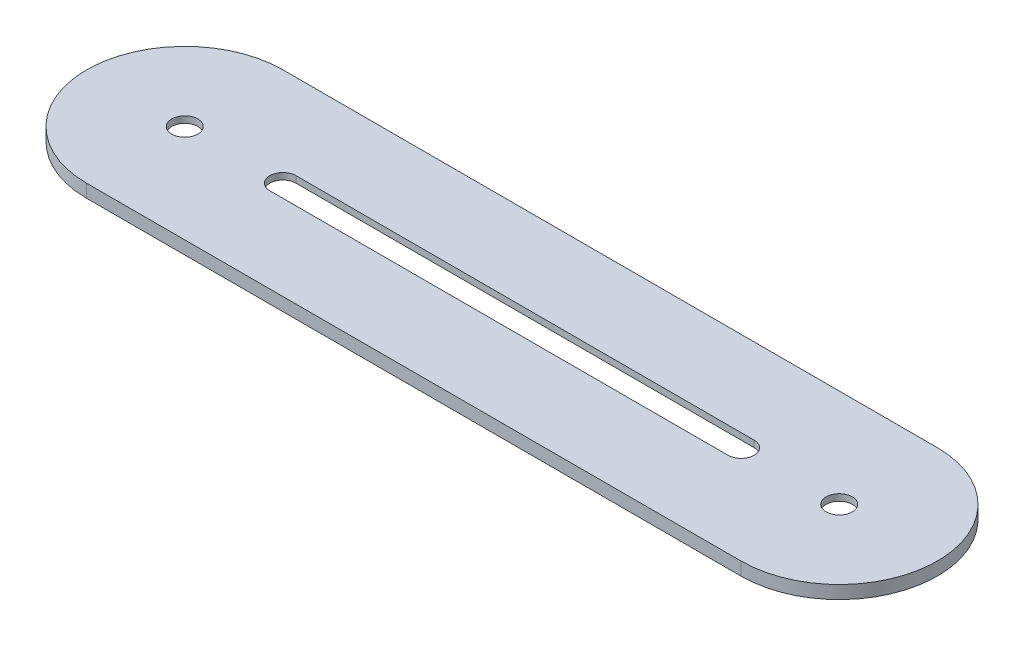
ISO-10303-21;
HEADER;
FILE_DESCRIPTION(('STEP AP214'),'2;1');
FILE_NAME('part.step','',(''),(''),'','','');
FILE_SCHEMA(('AUTOMOTIVE_DESIGN { 1 0 10303 214 1 1 1 1 }'));
ENDSEC;
DATA;
#1=APPLICATION_CONTEXT('core data for automotive mechanical design processes');
#2=APPLICATION_PROTOCOL_DEFINITION('international standard','automotive_design',2000,#1);
#3=PRODUCT_CONTEXT('',#1,'mechanical');
#4=PRODUCT('Part','Part','',(#3));
#5=PRODUCT_RELATED_PRODUCT_CATEGORY('part','',(#4));
#6=PRODUCT_DEFINITION_FORMATION('','',#4);
#7=PRODUCT_DEFINITION_CONTEXT('part definition',#1,'design');
#8=PRODUCT_DEFINITION('design','',#6,#7);
#9=PRODUCT_DEFINITION_SHAPE('','',#8);
#10=(LENGTH_UNIT() NAMED_UNIT(*) SI_UNIT(.MILLI.,.METRE.));
#11=(NAMED_UNIT(*) PLANE_ANGLE_UNIT() SI_UNIT($,.RADIAN.));
#12=(NAMED_UNIT(*) SI_UNIT($,.STERADIAN.) SOLID_ANGLE_UNIT());
#13=UNCERTAINTY_MEASURE_WITH_UNIT(LENGTH_MEASURE(1.E-05),#10,'distance_accuracy_value','');
#14=(GEOMETRIC_REPRESENTATION_CONTEXT(3) GLOBAL_UNCERTAINTY_ASSIGNED_CONTEXT((#13)) GLOBAL_UNIT_ASSIGNED_CONTEXT((#10,
#11,#12)) REPRESENTATION_CONTEXT('',''));
#15=CARTESIAN_POINT('',(0.,0.,0.));
#16=DIRECTION('',(0.,0.,1.));
#17=DIRECTION('',(1.,0.,0.));
#18=AXIS2_PLACEMENT_3D('',#15,#16,#17);
#19=CARTESIAN_POINT('',(175.,5.,0.));
#20=DIRECTION('',(0.,-1.,0.));
#21=DIRECTION('',(0.,0.,-1.));
#22=AXIS2_PLACEMENT_3D('',#19,#20,#21);
#23=CYLINDRICAL_SURFACE('',#22,10.);
#24=DIRECTION('',(0.,-1.,0.));
#25=VECTOR('',#24,1.);
#26=CARTESIAN_POINT('',(175.,5.,-10.));
#27=LINE('',#26,#25);
#28=CARTESIAN_POINT('',(175.,5.,-10.));
#29=VERTEX_POINT('',#28);
#30=CARTESIAN_POINT('',(175.,0.,-10.));
#31=VERTEX_POINT('',#30);
#32=EDGE_CURVE('E207',#29,#31,#27,.T.);
#33=ORIENTED_EDGE('',*,*,#32,.T.);
#34=CARTESIAN_POINT('',(175.,0.,0.));
#35=DIRECTION('',(0.,-1.,0.));
#36=DIRECTION('',(0.,0.,-1.));
#37=AXIS2_PLACEMENT_3D('',#34,#35,#36);
#38=CIRCLE('',#37,10.);
#39=CARTESIAN_POINT('',(175.,0.,10.));
#40=VERTEX_POINT('',#39);
#41=EDGE_CURVE('E180',#31,#40,#38,.T.);
#42=ORIENTED_EDGE('',*,*,#41,.T.);
#43=DIRECTION('',(0.,-1.,0.));
#44=VECTOR('',#43,1.);
#45=CARTESIAN_POINT('',(175.,5.,10.));
#46=LINE('',#45,#44);
#47=CARTESIAN_POINT('',(175.,5.,10.));
#48=VERTEX_POINT('',#47);
#49=EDGE_CURVE('E198',#48,#40,#46,.T.);
#50=ORIENTED_EDGE('',*,*,#49,.F.);
#51=CARTESIAN_POINT('',(175.,5.,0.));
#52=DIRECTION('',(0.,1.,0.));
#53=DIRECTION('',(0.,0.,1.));
#54=AXIS2_PLACEMENT_3D('',#51,#52,#53);
#55=CIRCLE('',#54,10.);
#56=EDGE_CURVE('E189',#48,#29,#55,.T.);
#57=ORIENTED_EDGE('',*,*,#56,.T.);
#58=EDGE_LOOP('',(#33,#42,#50,#57));
#59=FACE_BOUND('',#58,.T.);
#60=ADVANCED_FACE('F43',(#59),#23,.F.);
#61=CARTESIAN_POINT('',(175.,5.,-10.));
#62=DIRECTION('',(0.,0.,1.));
#63=DIRECTION('',(1.,0.,0.));
#64=AXIS2_PLACEMENT_3D('',#61,#62,#63);
#65=PLANE('',#64);
#66=DIRECTION('',(0.,-1.,0.));
#67=VECTOR('',#66,1.);
#68=CARTESIAN_POINT('',(-175.,5.,-9.99999999999998));
#69=LINE('',#68,#67);
#70=CARTESIAN_POINT('',(-175.,5.,-9.99999999999998));
#71=VERTEX_POINT('',#70);
#72=CARTESIAN_POINT('',(-175.,0.,-9.99999999999998));
#73=VERTEX_POINT('',#72);
#74=EDGE_CURVE('E204',#71,#73,#69,.T.);
#75=ORIENTED_EDGE('',*,*,#74,.T.);
#76=DIRECTION('',(1.,0.,0.));
#77=VECTOR('',#76,1.);
#78=CARTESIAN_POINT('',(175.,0.,-10.));
#79=LINE('',#78,#77);
#80=EDGE_CURVE('E177',#73,#31,#79,.T.);
#81=ORIENTED_EDGE('',*,*,#80,.T.);
#82=ORIENTED_EDGE('',*,*,#32,.F.);
#83=DIRECTION('',(-1.,0.,0.));
#84=VECTOR('',#83,1.);
#85=CARTESIAN_POINT('',(175.,5.,-10.));
#86=LINE('',#85,#84);
#87=EDGE_CURVE('E191',#29,#71,#86,.T.);
#88=ORIENTED_EDGE('',*,*,#87,.T.);
#89=EDGE_LOOP('',(#75,#81,#82,#88));
#90=FACE_BOUND('',#89,.T.);
#91=ADVANCED_FACE('F264',(#90),#65,.T.);
#92=CARTESIAN_POINT('',(-175.,5.,0.));
#93=DIRECTION('',(0.,-1.,0.));
#94=DIRECTION('',(0.,0.,-1.));
#95=AXIS2_PLACEMENT_3D('',#92,#93,#94);
#96=CYLINDRICAL_SURFACE('',#95,10.);
#97=DIRECTION('',(0.,-1.,0.));
#98=VECTOR('',#97,1.);
#99=CARTESIAN_POINT('',(-175.,5.,10.));
#100=LINE('',#99,#98);
#101=CARTESIAN_POINT('',(-175.,5.,10.));
#102=VERTEX_POINT('',#101);
#103=CARTESIAN_POINT('',(-175.,0.,10.));
#104=VERTEX_POINT('',#103);
#105=EDGE_CURVE('E201',#102,#104,#100,.T.);
#106=ORIENTED_EDGE('',*,*,#105,.T.);
#107=CARTESIAN_POINT('',(-175.,0.,0.));
#108=DIRECTION('',(0.,-1.,0.));
#109=DIRECTION('',(0.,0.,-1.));
#110=AXIS2_PLACEMENT_3D('',#107,#108,#109);
#111=CIRCLE('',#110,10.);
#112=EDGE_CURVE('E67',#104,#73,#111,.T.);
#113=ORIENTED_EDGE('',*,*,#112,.T.);
#114=ORIENTED_EDGE('',*,*,#74,.F.);
#115=CARTESIAN_POINT('',(-175.,5.,0.));
#116=DIRECTION('',(0.,1.,0.));
#117=DIRECTION('',(0.,0.,1.));
#118=AXIS2_PLACEMENT_3D('',#115,#116,#117);
#119=CIRCLE('',#118,10.);
#120=EDGE_CURVE('E193',#71,#102,#119,.T.);
#121=ORIENTED_EDGE('',*,*,#120,.T.);
#122=EDGE_LOOP('',(#106,#113,#114,#121));
#123=FACE_BOUND('',#122,.T.);
#124=ADVANCED_FACE('F271',(#123),#96,.F.);
#125=CARTESIAN_POINT('',(175.,5.,10.));
#126=DIRECTION('',(0.,0.,-1.));
#127=DIRECTION('',(-1.,0.,0.));
#128=AXIS2_PLACEMENT_3D('',#125,#126,#127);
#129=PLANE('',#128);
#130=ORIENTED_EDGE('',*,*,#49,.T.);
#131=DIRECTION('',(-1.,0.,0.));
#132=VECTOR('',#131,1.);
#133=CARTESIAN_POINT('',(175.,0.,10.));
#134=LINE('',#133,#132);
#135=EDGE_CURVE('E174',#40,#104,#134,.T.);
#136=ORIENTED_EDGE('',*,*,#135,.T.);
#137=ORIENTED_EDGE('',*,*,#105,.F.);
#138=DIRECTION('',(1.,0.,0.));
#139=VECTOR('',#138,1.);
#140=CARTESIAN_POINT('',(175.,5.,10.));
#141=LINE('',#140,#139);
#142=EDGE_CURVE('E196',#102,#48,#141,.T.);
#143=ORIENTED_EDGE('',*,*,#142,.T.);
#144=EDGE_LOOP('',(#130,#136,#137,#143));
#145=FACE_BOUND('',#144,.T.);
#146=ADVANCED_FACE('F303',(#145),#129,.T.);
#147=CARTESIAN_POINT('',(-250.,5.,0.));
#148=DIRECTION('',(0.,-1.,0.));
#149=DIRECTION('',(0.,0.,-1.));
#150=AXIS2_PLACEMENT_3D('',#147,#148,#149);
#151=CYLINDRICAL_SURFACE('',#150,9.99999999999998);
#152=CARTESIAN_POINT('',(-250.,5.,0.));
#153=DIRECTION('',(0.,1.,0.));
#154=DIRECTION('',(0.,0.,1.));
#155=AXIS2_PLACEMENT_3D('',#152,#153,#154);
#156=CIRCLE('',#155,9.99999999999998);
#157=CARTESIAN_POINT('',(-250.,5.,10.0000000000001));
#158=VERTEX_POINT('',#157);
#159=EDGE_CURVE('E186',#158,#158,#156,.T.);
#160=ORIENTED_EDGE('',*,*,#159,.T.);
#161=EDGE_LOOP('',(#160));
#162=FACE_BOUND('',#161,.T.);
#163=CARTESIAN_POINT('',(-250.,0.,0.));
#164=DIRECTION('',(0.,-1.,0.));
#165=DIRECTION('',(0.,0.,-1.));
#166=AXIS2_PLACEMENT_3D('',#163,#164,#165);
#167=CIRCLE('',#166,9.99999999999998);
#168=CARTESIAN_POINT('',(-250.,0.,-9.99999999999989));
#169=VERTEX_POINT('',#168);
#170=EDGE_CURVE('E171',#169,#169,#167,.T.);
#171=ORIENTED_EDGE('',*,*,#170,.T.);
#172=EDGE_LOOP('',(#171));
#173=FACE_BOUND('',#172,.T.);
#174=ADVANCED_FACE('F299',(#162,#173),#151,.F.);
#175=CARTESIAN_POINT('',(250.,5.,0.));
#176=DIRECTION('',(0.,-1.,0.));
#177=DIRECTION('',(0.,0.,-1.));
#178=AXIS2_PLACEMENT_3D('',#175,#176,#177);
#179=CYLINDRICAL_SURFACE('',#178,9.99999999999998);
#180=CARTESIAN_POINT('',(250.,5.,0.));
#181=DIRECTION('',(0.,1.,0.));
#182=DIRECTION('',(0.,0.,-1.));
#183=AXIS2_PLACEMENT_3D('',#180,#181,#182);
#184=CIRCLE('',#183,9.99999999999998);
#185=CARTESIAN_POINT('',(250.,5.,-9.99999999999989));
#186=VERTEX_POINT('',#185);
#187=EDGE_CURVE('E183',#186,#186,#184,.T.);
#188=ORIENTED_EDGE('',*,*,#187,.T.);
#189=EDGE_LOOP('',(#188));
#190=FACE_BOUND('',#189,.T.);
#191=CARTESIAN_POINT('',(250.,0.,0.));
#192=DIRECTION('',(0.,-1.,0.));
#193=DIRECTION('',(0.,0.,-1.));
#194=AXIS2_PLACEMENT_3D('',#191,#192,#193);
#195=CIRCLE('',#194,9.99999999999998);
#196=CARTESIAN_POINT('',(250.,0.,-9.99999999999989));
#197=VERTEX_POINT('',#196);
#198=EDGE_CURVE('E47',#197,#197,#195,.T.);
#199=ORIENTED_EDGE('',*,*,#198,.T.);
#200=EDGE_LOOP('',(#199));
#201=FACE_BOUND('',#200,.T.);
#202=ADVANCED_FACE('F278',(#190,#201),#179,.F.);
#203=CARTESIAN_POINT('',(250.,5.,0.));
#204=DIRECTION('',(0.,1.,0.));
#205=DIRECTION('',(0.,0.,1.));
#206=AXIS2_PLACEMENT_3D('',#203,#204,#205);
#207=PLANE('',#206);
#208=ORIENTED_EDGE('',*,*,#159,.F.);
#209=EDGE_LOOP('',(#208));
#210=FACE_BOUND('',#209,.T.);
#211=CARTESIAN_POINT('',(250.,5.,0.));
#212=DIRECTION('',(0.,1.,0.));
#213=DIRECTION('',(0.,0.,1.));
#214=AXIS2_PLACEMENT_3D('',#211,#212,#213);
#215=CIRCLE('',#214,75.);
#216=CARTESIAN_POINT('',(250.,5.,75.));
#217=VERTEX_POINT('',#216);
#218=CARTESIAN_POINT('',(250.,5.,-75.));
#219=VERTEX_POINT('',#218);
#220=EDGE_CURVE('E211',#217,#219,#215,.T.);
#221=ORIENTED_EDGE('',*,*,#220,.T.);
#222=DIRECTION('',(-1.,0.,0.));
#223=VECTOR('',#222,1.);
#224=CARTESIAN_POINT('',(250.,5.,-75.));
#225=LINE('',#224,#223);
#226=CARTESIAN_POINT('',(-250.,5.,-74.9999999999999));
#227=VERTEX_POINT('',#226);
#228=EDGE_CURVE('E214',#219,#227,#225,.T.);
#229=ORIENTED_EDGE('',*,*,#228,.T.);
#230=CARTESIAN_POINT('',(-250.,5.,0.));
#231=DIRECTION('',(0.,1.,0.));
#232=DIRECTION('',(0.,0.,1.));
#233=AXIS2_PLACEMENT_3D('',#230,#231,#232);
#234=CIRCLE('',#233,75.);
#235=CARTESIAN_POINT('',(-250.,5.,75.0000000000001));
#236=VERTEX_POINT('',#235);
#237=EDGE_CURVE('E217',#227,#236,#234,.T.);
#238=ORIENTED_EDGE('',*,*,#237,.T.);
#239=DIRECTION('',(1.,0.,0.));
#240=VECTOR('',#239,1.);
#241=CARTESIAN_POINT('',(250.,5.,75.));
#242=LINE('',#241,#240);
#243=EDGE_CURVE('E219',#236,#217,#242,.T.);
#244=ORIENTED_EDGE('',*,*,#243,.T.);
#245=EDGE_LOOP('',(#221,#229,#238,#244));
#246=FACE_BOUND('',#245,.T.);
#247=ORIENTED_EDGE('',*,*,#87,.F.);
#248=ORIENTED_EDGE('',*,*,#56,.F.);
#249=ORIENTED_EDGE('',*,*,#142,.F.);
#250=ORIENTED_EDGE('',*,*,#120,.F.);
#251=EDGE_LOOP('',(#247,#248,#249,#250));
#252=FACE_BOUND('',#251,.T.);
#253=ORIENTED_EDGE('',*,*,#187,.F.);
#254=EDGE_LOOP('',(#253));
#255=FACE_BOUND('',#254,.T.);
#256=ADVANCED_FACE('F254',(#210,#246,#252,#255),#207,.T.);
#257=CARTESIAN_POINT('',(250.,-5.,0.));
#258=DIRECTION('',(0.,1.,0.));
#259=DIRECTION('',(0.,0.,1.));
#260=AXIS2_PLACEMENT_3D('',#257,#258,#259);
#261=PLANE('',#260);
#262=DIRECTION('',(-1.,0.,0.));
#263=VECTOR('',#262,1.);
#264=CARTESIAN_POINT('',(250.,-5.,72.));
#265=LINE('',#264,#263);
#266=CARTESIAN_POINT('',(250.,-5.,72.));
#267=VERTEX_POINT('',#266);
#268=CARTESIAN_POINT('',(-250.,-5.,72.));
#269=VERTEX_POINT('',#268);
#270=EDGE_CURVE('E162',#267,#269,#265,.T.);
#271=ORIENTED_EDGE('',*,*,#270,.F.);
#272=CARTESIAN_POINT('',(250.,-5.,0.));
#273=DIRECTION('',(0.,-1.,0.));
#274=DIRECTION('',(0.,0.,-1.));
#275=AXIS2_PLACEMENT_3D('',#272,#273,#274);
#276=CIRCLE('',#275,72.);
#277=CARTESIAN_POINT('',(250.,-5.,-71.9999999999999));
#278=VERTEX_POINT('',#277);
#279=EDGE_CURVE('E59',#278,#267,#276,.T.);
#280=ORIENTED_EDGE('',*,*,#279,.F.);
#281=DIRECTION('',(1.,0.,0.));
#282=VECTOR('',#281,1.);
#283=CARTESIAN_POINT('',(-250.,-5.,-71.9999999999999));
#284=LINE('',#283,#282);
#285=CARTESIAN_POINT('',(-250.,-5.,-71.9999999999999));
#286=VERTEX_POINT('',#285);
#287=EDGE_CURVE('E153',#286,#278,#284,.T.);
#288=ORIENTED_EDGE('',*,*,#287,.F.);
#289=CARTESIAN_POINT('',(-250.,-5.,0.));
#290=DIRECTION('',(0.,-1.,0.));
#291=DIRECTION('',(0.,0.,-1.));
#292=AXIS2_PLACEMENT_3D('',#289,#290,#291);
#293=CIRCLE('',#292,72.);
#294=EDGE_CURVE('E156',#269,#286,#293,.T.);
#295=ORIENTED_EDGE('',*,*,#294,.F.);
#296=EDGE_LOOP('',(#271,#280,#288,#295));
#297=FACE_BOUND('',#296,.T.);
#298=CARTESIAN_POINT('',(250.,-5.,0.));
#299=DIRECTION('',(0.,1.,0.));
#300=DIRECTION('',(0.,0.,1.));
#301=AXIS2_PLACEMENT_3D('',#298,#299,#300);
#302=CIRCLE('',#301,75.);
#303=CARTESIAN_POINT('',(250.,-5.,75.));
#304=VERTEX_POINT('',#303);
#305=CARTESIAN_POINT('',(250.,-5.,-75.));
#306=VERTEX_POINT('',#305);
#307=EDGE_CURVE('E210',#304,#306,#302,.T.);
#308=ORIENTED_EDGE('',*,*,#307,.F.);
#309=DIRECTION('',(1.,0.,0.));
#310=VECTOR('',#309,1.);
#311=CARTESIAN_POINT('',(250.,-5.,75.));
#312=LINE('',#311,#310);
#313=CARTESIAN_POINT('',(-250.,-5.,75.0000000000001));
#314=VERTEX_POINT('',#313);
#315=EDGE_CURVE('E215',#314,#304,#312,.T.);
#316=ORIENTED_EDGE('',*,*,#315,.F.);
#317=CARTESIAN_POINT('',(-250.,-5.,0.));
#318=DIRECTION('',(0.,1.,0.));
#319=DIRECTION('',(0.,0.,1.));
#320=AXIS2_PLACEMENT_3D('',#317,#318,#319);
#321=CIRCLE('',#320,75.);
#322=CARTESIAN_POINT('',(-250.,-5.,-74.9999999999999));
#323=VERTEX_POINT('',#322);
#324=EDGE_CURVE('E226',#323,#314,#321,.T.);
#325=ORIENTED_EDGE('',*,*,#324,.F.);
#326=DIRECTION('',(-1.,0.,0.));
#327=VECTOR('',#326,1.);
#328=CARTESIAN_POINT('',(250.,-5.,-75.));
#329=LINE('',#328,#327);
#330=EDGE_CURVE('E224',#306,#323,#329,.T.);
#331=ORIENTED_EDGE('',*,*,#330,.F.);
#332=EDGE_LOOP('',(#308,#316,#325,#331));
#333=FACE_BOUND('',#332,.T.);
#334=ADVANCED_FACE('F245',(#297,#333),#261,.F.);
#335=CARTESIAN_POINT('',(250.,5.,0.));
#336=DIRECTION('',(0.,-1.,0.));
#337=DIRECTION('',(0.,0.,-1.));
#338=AXIS2_PLACEMENT_3D('',#335,#336,#337);
#339=CYLINDRICAL_SURFACE('',#338,75.);
#340=ORIENTED_EDGE('',*,*,#307,.T.);
#341=DIRECTION('',(0.,-1.,0.));
#342=VECTOR('',#341,1.);
#343=CARTESIAN_POINT('',(250.,5.,-75.));
#344=LINE('',#343,#342);
#345=EDGE_CURVE('E11',#219,#306,#344,.T.);
#346=ORIENTED_EDGE('',*,*,#345,.F.);
#347=ORIENTED_EDGE('',*,*,#220,.F.);
#348=DIRECTION('',(0.,-1.,0.));
#349=VECTOR('',#348,1.);
#350=CARTESIAN_POINT('',(250.,5.,75.));
#351=LINE('',#350,#349);
#352=EDGE_CURVE('E221',#217,#304,#351,.T.);
#353=ORIENTED_EDGE('',*,*,#352,.T.);
#354=EDGE_LOOP('',(#340,#346,#347,#353));
#355=FACE_BOUND('',#354,.T.);
#356=ADVANCED_FACE('F45',(#355),#339,.T.);
#357=CARTESIAN_POINT('',(250.,5.,-75.));
#358=DIRECTION('',(0.,0.,1.));
#359=DIRECTION('',(1.,0.,0.));
#360=AXIS2_PLACEMENT_3D('',#357,#358,#359);
#361=PLANE('',#360);
#362=ORIENTED_EDGE('',*,*,#330,.T.);
#363=DIRECTION('',(0.,-1.,0.));
#364=VECTOR('',#363,1.);
#365=CARTESIAN_POINT('',(-250.,5.,-74.9999999999999));
#366=LINE('',#365,#364);
#367=EDGE_CURVE('E52',#227,#323,#366,.T.);
#368=ORIENTED_EDGE('',*,*,#367,.F.);
#369=ORIENTED_EDGE('',*,*,#228,.F.);
#370=ORIENTED_EDGE('',*,*,#345,.T.);
#371=EDGE_LOOP('',(#362,#368,#369,#370));
#372=FACE_BOUND('',#371,.T.);
#373=ADVANCED_FACE('F256',(#372),#361,.F.);
#374=CARTESIAN_POINT('',(-250.,5.,0.));
#375=DIRECTION('',(0.,-1.,0.));
#376=DIRECTION('',(0.,0.,-1.));
#377=AXIS2_PLACEMENT_3D('',#374,#375,#376);
#378=CYLINDRICAL_SURFACE('',#377,75.);
#379=ORIENTED_EDGE('',*,*,#324,.T.);
#380=DIRECTION('',(0.,-1.,0.));
#381=VECTOR('',#380,1.);
#382=CARTESIAN_POINT('',(-250.,5.,75.0000000000001));
#383=LINE('',#382,#381);
#384=EDGE_CURVE('E231',#236,#314,#383,.T.);
#385=ORIENTED_EDGE('',*,*,#384,.F.);
#386=ORIENTED_EDGE('',*,*,#237,.F.);
#387=ORIENTED_EDGE('',*,*,#367,.T.);
#388=EDGE_LOOP('',(#379,#385,#386,#387));
#389=FACE_BOUND('',#388,.T.);
#390=ADVANCED_FACE('F239',(#389),#378,.T.);
#391=CARTESIAN_POINT('',(250.,5.,75.));
#392=DIRECTION('',(0.,0.,-1.));
#393=DIRECTION('',(-1.,0.,0.));
#394=AXIS2_PLACEMENT_3D('',#391,#392,#393);
#395=PLANE('',#394);
#396=ORIENTED_EDGE('',*,*,#315,.T.);
#397=ORIENTED_EDGE('',*,*,#352,.F.);
#398=ORIENTED_EDGE('',*,*,#243,.F.);
#399=ORIENTED_EDGE('',*,*,#384,.T.);
#400=EDGE_LOOP('',(#396,#397,#398,#399));
#401=FACE_BOUND('',#400,.T.);
#402=ADVANCED_FACE('F248',(#401),#395,.F.);
#403=CARTESIAN_POINT('',(250.,0.,0.));
#404=DIRECTION('',(0.,-1.,0.));
#405=DIRECTION('',(0.,0.,-1.));
#406=AXIS2_PLACEMENT_3D('',#403,#404,#405);
#407=CYLINDRICAL_SURFACE('',#406,72.);
#408=ORIENTED_EDGE('',*,*,#279,.T.);
#409=DIRECTION('',(0.,-1.,0.));
#410=VECTOR('',#409,1.);
#411=CARTESIAN_POINT('',(250.,0.,72.));
#412=LINE('',#411,#410);
#413=CARTESIAN_POINT('',(250.,0.,72.));
#414=VERTEX_POINT('',#413);
#415=EDGE_CURVE('E131',#414,#267,#412,.T.);
#416=ORIENTED_EDGE('',*,*,#415,.F.);
#417=CARTESIAN_POINT('',(250.,0.,0.));
#418=DIRECTION('',(0.,-1.,0.));
#419=DIRECTION('',(0.,0.,-1.));
#420=AXIS2_PLACEMENT_3D('',#417,#418,#419);
#421=CIRCLE('',#420,72.);
#422=CARTESIAN_POINT('',(250.,0.,-71.9999999999999));
#423=VERTEX_POINT('',#422);
#424=EDGE_CURVE('E135',#423,#414,#421,.T.);
#425=ORIENTED_EDGE('',*,*,#424,.F.);
#426=DIRECTION('',(0.,-1.,0.));
#427=VECTOR('',#426,1.);
#428=CARTESIAN_POINT('',(250.,0.,-71.9999999999999));
#429=LINE('',#428,#427);
#430=EDGE_CURVE('E166',#423,#278,#429,.T.);
#431=ORIENTED_EDGE('',*,*,#430,.T.);
#432=EDGE_LOOP('',(#408,#416,#425,#431));
#433=FACE_BOUND('',#432,.T.);
#434=ADVANCED_FACE('F133',(#433),#407,.F.);
#435=CARTESIAN_POINT('',(-250.,0.,-71.9999999999999));
#436=DIRECTION('',(0.,0.,-1.));
#437=DIRECTION('',(-1.,0.,0.));
#438=AXIS2_PLACEMENT_3D('',#435,#436,#437);
#439=PLANE('',#438);
#440=ORIENTED_EDGE('',*,*,#287,.T.);
#441=ORIENTED_EDGE('',*,*,#430,.F.);
#442=DIRECTION('',(1.,0.,0.));
#443=VECTOR('',#442,1.);
#444=CARTESIAN_POINT('',(-250.,0.,-71.9999999999999));
#445=LINE('',#444,#443);
#446=CARTESIAN_POINT('',(-250.,0.,-71.9999999999999));
#447=VERTEX_POINT('',#446);
#448=EDGE_CURVE('E141',#447,#423,#445,.T.);
#449=ORIENTED_EDGE('',*,*,#448,.F.);
#450=DIRECTION('',(0.,-1.,0.));
#451=VECTOR('',#450,1.);
#452=CARTESIAN_POINT('',(-250.,0.,-71.9999999999999));
#453=LINE('',#452,#451);
#454=EDGE_CURVE('E168',#447,#286,#453,.T.);
#455=ORIENTED_EDGE('',*,*,#454,.T.);
#456=EDGE_LOOP('',(#440,#441,#449,#455));
#457=FACE_BOUND('',#456,.T.);
#458=ADVANCED_FACE('F286',(#457),#439,.F.);
#459=CARTESIAN_POINT('',(-250.,0.,0.));
#460=DIRECTION('',(0.,-1.,0.));
#461=DIRECTION('',(0.,0.,-1.));
#462=AXIS2_PLACEMENT_3D('',#459,#460,#461);
#463=CYLINDRICAL_SURFACE('',#462,72.);
#464=ORIENTED_EDGE('',*,*,#294,.T.);
#465=ORIENTED_EDGE('',*,*,#454,.F.);
#466=CARTESIAN_POINT('',(-250.,0.,0.));
#467=DIRECTION('',(0.,-1.,0.));
#468=DIRECTION('',(0.,0.,-1.));
#469=AXIS2_PLACEMENT_3D('',#466,#467,#468);
#470=CIRCLE('',#469,72.);
#471=CARTESIAN_POINT('',(-250.,0.,72.));
#472=VERTEX_POINT('',#471);
#473=EDGE_CURVE('E149',#472,#447,#470,.T.);
#474=ORIENTED_EDGE('',*,*,#473,.F.);
#475=DIRECTION('',(0.,-1.,0.));
#476=VECTOR('',#475,1.);
#477=CARTESIAN_POINT('',(-250.,0.,72.));
#478=LINE('',#477,#476);
#479=EDGE_CURVE('E140',#472,#269,#478,.T.);
#480=ORIENTED_EDGE('',*,*,#479,.T.);
#481=EDGE_LOOP('',(#464,#465,#474,#480));
#482=FACE_BOUND('',#481,.T.);
#483=ADVANCED_FACE('F291',(#482),#463,.F.);
#484=CARTESIAN_POINT('',(250.,0.,72.));
#485=DIRECTION('',(0.,0.,1.));
#486=DIRECTION('',(1.,0.,0.));
#487=AXIS2_PLACEMENT_3D('',#484,#485,#486);
#488=PLANE('',#487);
#489=ORIENTED_EDGE('',*,*,#270,.T.);
#490=ORIENTED_EDGE('',*,*,#479,.F.);
#491=DIRECTION('',(-1.,0.,0.));
#492=VECTOR('',#491,1.);
#493=CARTESIAN_POINT('',(250.,0.,72.));
#494=LINE('',#493,#492);
#495=EDGE_CURVE('E144',#414,#472,#494,.T.);
#496=ORIENTED_EDGE('',*,*,#495,.F.);
#497=ORIENTED_EDGE('',*,*,#415,.T.);
#498=EDGE_LOOP('',(#489,#490,#496,#497));
#499=FACE_BOUND('',#498,.T.);
#500=ADVANCED_FACE('F145',(#499),#488,.F.);
#501=CARTESIAN_POINT('',(250.,0.,0.));
#502=DIRECTION('',(0.,-1.,0.));
#503=DIRECTION('',(0.,0.,-1.));
#504=AXIS2_PLACEMENT_3D('',#501,#502,#503);
#505=PLANE('',#504);
#506=ORIENTED_EDGE('',*,*,#80,.F.);
#507=ORIENTED_EDGE('',*,*,#112,.F.);
#508=ORIENTED_EDGE('',*,*,#135,.F.);
#509=ORIENTED_EDGE('',*,*,#41,.F.);
#510=EDGE_LOOP('',(#506,#507,#508,#509));
#511=FACE_BOUND('',#510,.T.);
#512=ORIENTED_EDGE('',*,*,#170,.F.);
#513=EDGE_LOOP('',(#512));
#514=FACE_BOUND('',#513,.T.);
#515=ORIENTED_EDGE('',*,*,#198,.F.);
#516=EDGE_LOOP('',(#515));
#517=FACE_BOUND('',#516,.T.);
#518=ORIENTED_EDGE('',*,*,#424,.T.);
#519=ORIENTED_EDGE('',*,*,#495,.T.);
#520=ORIENTED_EDGE('',*,*,#473,.T.);
#521=ORIENTED_EDGE('',*,*,#448,.T.);
#522=EDGE_LOOP('',(#518,#519,#520,#521));
#523=FACE_BOUND('',#522,.T.);
#524=ADVANCED_FACE('F151',(#511,#514,#517,#523),#505,.T.);
#525=CLOSED_SHELL('',(#60,#91,#124,#146,#174,#202,#256,#334,#356,#373,#390,#402,#434,#458,#483,
#500,#524));
#526=MANIFOLD_SOLID_BREP('B2',#525);
#527=ADVANCED_BREP_SHAPE_REPRESENTATION('',(#18,#526),#14);
#528=SHAPE_DEFINITION_REPRESENTATION(#9,#527);
ENDSEC;
END-ISO-10303-21;
